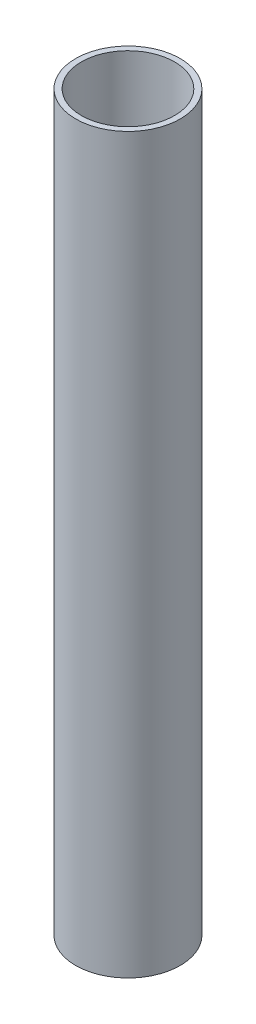
ISO-10303-21;
HEADER;
FILE_DESCRIPTION(('STEP AP214'),'2;1');
FILE_NAME('part.step','',(''),(''),'','','');
FILE_SCHEMA(('AUTOMOTIVE_DESIGN { 1 0 10303 214 1 1 1 1 }'));
ENDSEC;
DATA;
#1=APPLICATION_CONTEXT('core data for automotive mechanical design processes');
#2=APPLICATION_PROTOCOL_DEFINITION('international standard','automotive_design',2000,#1);
#3=PRODUCT_CONTEXT('',#1,'mechanical');
#4=PRODUCT('Part','Part','',(#3));
#5=PRODUCT_RELATED_PRODUCT_CATEGORY('part','',(#4));
#6=PRODUCT_DEFINITION_FORMATION('','',#4);
#7=PRODUCT_DEFINITION_CONTEXT('part definition',#1,'design');
#8=PRODUCT_DEFINITION('design','',#6,#7);
#9=PRODUCT_DEFINITION_SHAPE('','',#8);
#10=(LENGTH_UNIT() NAMED_UNIT(*) SI_UNIT(.MILLI.,.METRE.));
#11=(NAMED_UNIT(*) PLANE_ANGLE_UNIT() SI_UNIT($,.RADIAN.));
#12=(NAMED_UNIT(*) SI_UNIT($,.STERADIAN.) SOLID_ANGLE_UNIT());
#13=UNCERTAINTY_MEASURE_WITH_UNIT(LENGTH_MEASURE(1.E-05),#10,'distance_accuracy_value','');
#14=(GEOMETRIC_REPRESENTATION_CONTEXT(3) GLOBAL_UNCERTAINTY_ASSIGNED_CONTEXT((#13)) GLOBAL_UNIT_ASSIGNED_CONTEXT((#10,
#11,#12)) REPRESENTATION_CONTEXT('',''));
#15=CARTESIAN_POINT('',(0.,0.,0.));
#16=DIRECTION('',(0.,0.,1.));
#17=DIRECTION('',(1.,0.,0.));
#18=AXIS2_PLACEMENT_3D('',#15,#16,#17);
#19=CARTESIAN_POINT('',(0.,101.6,0.));
#20=DIRECTION('',(0.,1.,0.));
#21=DIRECTION('',(0.,0.,1.));
#22=AXIS2_PLACEMENT_3D('',#19,#20,#21);
#23=PLANE('',#22);
#24=CARTESIAN_POINT('',(0.,101.6,0.));
#25=DIRECTION('',(0.,1.,0.));
#26=DIRECTION('',(0.,0.,1.));
#27=AXIS2_PLACEMENT_3D('',#24,#25,#26);
#28=CIRCLE('',#27,14.5);
#29=CARTESIAN_POINT('',(0.,101.6,14.5));
#30=VERTEX_POINT('',#29);
#31=EDGE_CURVE('E10',#30,#30,#28,.T.);
#32=ORIENTED_EDGE('',*,*,#31,.T.);
#33=EDGE_LOOP('',(#32));
#34=FACE_BOUND('',#33,.T.);
#35=CARTESIAN_POINT('',(0.,101.6,0.));
#36=DIRECTION('',(0.,1.,0.));
#37=DIRECTION('',(0.,0.,1.));
#38=AXIS2_PLACEMENT_3D('',#35,#36,#37);
#39=CIRCLE('',#38,12.9125);
#40=CARTESIAN_POINT('',(0.,101.6,12.9125));
#41=VERTEX_POINT('',#40);
#42=EDGE_CURVE('E50',#41,#41,#39,.T.);
#43=ORIENTED_EDGE('',*,*,#42,.F.);
#44=EDGE_LOOP('',(#43));
#45=FACE_BOUND('',#44,.T.);
#46=ADVANCED_FACE('F37',(#34,#45),#23,.T.);
#47=CARTESIAN_POINT('',(0.,-101.6,0.));
#48=DIRECTION('',(0.,1.,0.));
#49=DIRECTION('',(0.,0.,1.));
#50=AXIS2_PLACEMENT_3D('',#47,#48,#49);
#51=PLANE('',#50);
#52=CARTESIAN_POINT('',(0.,-101.6,0.));
#53=DIRECTION('',(0.,1.,0.));
#54=DIRECTION('',(0.,0.,1.));
#55=AXIS2_PLACEMENT_3D('',#52,#53,#54);
#56=CIRCLE('',#55,14.5);
#57=CARTESIAN_POINT('',(0.,-101.6,14.5));
#58=VERTEX_POINT('',#57);
#59=EDGE_CURVE('E41',#58,#58,#56,.T.);
#60=ORIENTED_EDGE('',*,*,#59,.F.);
#61=EDGE_LOOP('',(#60));
#62=FACE_BOUND('',#61,.T.);
#63=CARTESIAN_POINT('',(0.,-101.6,0.));
#64=DIRECTION('',(0.,1.,0.));
#65=DIRECTION('',(0.,0.,1.));
#66=AXIS2_PLACEMENT_3D('',#63,#64,#65);
#67=CIRCLE('',#66,12.9125);
#68=CARTESIAN_POINT('',(0.,-101.6,12.9125));
#69=VERTEX_POINT('',#68);
#70=EDGE_CURVE('E52',#69,#69,#67,.T.);
#71=ORIENTED_EDGE('',*,*,#70,.T.);
#72=EDGE_LOOP('',(#71));
#73=FACE_BOUND('',#72,.T.);
#74=ADVANCED_FACE('F64',(#62,#73),#51,.F.);
#75=CARTESIAN_POINT('',(0.,101.6,0.));
#76=DIRECTION('',(0.,-1.,0.));
#77=DIRECTION('',(0.,0.,-1.));
#78=AXIS2_PLACEMENT_3D('',#75,#76,#77);
#79=CYLINDRICAL_SURFACE('',#78,14.5);
#80=ORIENTED_EDGE('',*,*,#31,.F.);
#81=EDGE_LOOP('',(#80));
#82=FACE_BOUND('',#81,.T.);
#83=ORIENTED_EDGE('',*,*,#59,.T.);
#84=EDGE_LOOP('',(#83));
#85=FACE_BOUND('',#84,.T.);
#86=ADVANCED_FACE('F39',(#82,#85),#79,.T.);
#87=CARTESIAN_POINT('',(0.,101.6,0.));
#88=DIRECTION('',(0.,-1.,0.));
#89=DIRECTION('',(0.,0.,-1.));
#90=AXIS2_PLACEMENT_3D('',#87,#88,#89);
#91=CYLINDRICAL_SURFACE('',#90,12.9125);
#92=ORIENTED_EDGE('',*,*,#42,.T.);
#93=EDGE_LOOP('',(#92));
#94=FACE_BOUND('',#93,.T.);
#95=ORIENTED_EDGE('',*,*,#70,.F.);
#96=EDGE_LOOP('',(#95));
#97=FACE_BOUND('',#96,.T.);
#98=ADVANCED_FACE('F60',(#94,#97),#91,.F.);
#99=CLOSED_SHELL('',(#46,#74,#86,#98));
#100=MANIFOLD_SOLID_BREP('B2',#99);
#101=ADVANCED_BREP_SHAPE_REPRESENTATION('',(#18,#100),#14);
#102=SHAPE_DEFINITION_REPRESENTATION(#9,#101);
ENDSEC;
END-ISO-10303-21;
